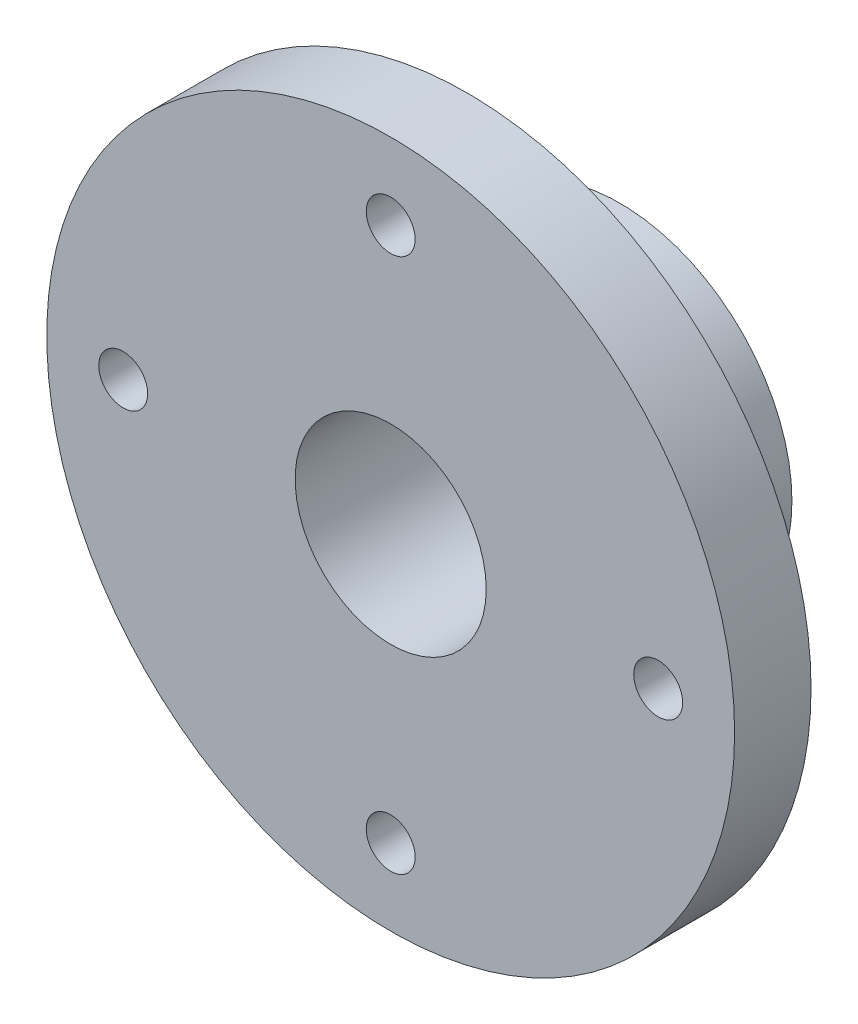
ISO-10303-21;
HEADER;
FILE_DESCRIPTION(('STEP AP214'),'2;1');
FILE_NAME('part.step','',(''),(''),'','','');
FILE_SCHEMA(('AUTOMOTIVE_DESIGN { 1 0 10303 214 1 1 1 1 }'));
ENDSEC;
DATA;
#1=APPLICATION_CONTEXT('core data for automotive mechanical design processes');
#2=APPLICATION_PROTOCOL_DEFINITION('international standard','automotive_design',2000,#1);
#3=PRODUCT_CONTEXT('',#1,'mechanical');
#4=PRODUCT('Part','Part','',(#3));
#5=PRODUCT_RELATED_PRODUCT_CATEGORY('part','',(#4));
#6=PRODUCT_DEFINITION_FORMATION('','',#4);
#7=PRODUCT_DEFINITION_CONTEXT('part definition',#1,'design');
#8=PRODUCT_DEFINITION('design','',#6,#7);
#9=PRODUCT_DEFINITION_SHAPE('','',#8);
#10=(LENGTH_UNIT() NAMED_UNIT(*) SI_UNIT(.MILLI.,.METRE.));
#11=(NAMED_UNIT(*) PLANE_ANGLE_UNIT() SI_UNIT($,.RADIAN.));
#12=(NAMED_UNIT(*) SI_UNIT($,.STERADIAN.) SOLID_ANGLE_UNIT());
#13=UNCERTAINTY_MEASURE_WITH_UNIT(LENGTH_MEASURE(1.E-05),#10,'distance_accuracy_value','');
#14=(GEOMETRIC_REPRESENTATION_CONTEXT(3) GLOBAL_UNCERTAINTY_ASSIGNED_CONTEXT((#13)) GLOBAL_UNIT_ASSIGNED_CONTEXT((#10,
#11,#12)) REPRESENTATION_CONTEXT('',''));
#15=CARTESIAN_POINT('',(0.,0.,0.));
#16=DIRECTION('',(0.,0.,1.));
#17=DIRECTION('',(1.,0.,0.));
#18=AXIS2_PLACEMENT_3D('',#15,#16,#17);
#19=CARTESIAN_POINT('',(0.,0.,-20.));
#20=DIRECTION('',(0.,0.,1.));
#21=DIRECTION('',(1.,0.,0.));
#22=AXIS2_PLACEMENT_3D('',#19,#20,#21);
#23=CYLINDRICAL_SURFACE('',#22,22.5);
#24=CARTESIAN_POINT('',(0.,0.,-20.));
#25=DIRECTION('',(0.,0.,1.));
#26=DIRECTION('',(1.,0.,0.));
#27=AXIS2_PLACEMENT_3D('',#24,#25,#26);
#28=CIRCLE('',#27,22.5);
#29=CARTESIAN_POINT('',(22.5,0.,-20.));
#30=VERTEX_POINT('',#29);
#31=EDGE_CURVE('E11',#30,#30,#28,.T.);
#32=ORIENTED_EDGE('',*,*,#31,.T.);
#33=EDGE_LOOP('',(#32));
#34=FACE_BOUND('',#33,.T.);
#35=CARTESIAN_POINT('',(0.,0.,0.));
#36=DIRECTION('',(0.,0.,1.));
#37=DIRECTION('',(1.,0.,0.));
#38=AXIS2_PLACEMENT_3D('',#35,#36,#37);
#39=CIRCLE('',#38,22.5);
#40=CARTESIAN_POINT('',(22.5,0.,0.));
#41=VERTEX_POINT('',#40);
#42=EDGE_CURVE('E54',#41,#41,#39,.T.);
#43=ORIENTED_EDGE('',*,*,#42,.F.);
#44=EDGE_LOOP('',(#43));
#45=FACE_BOUND('',#44,.T.);
#46=ADVANCED_FACE('F43',(#34,#45),#23,.T.);
#47=CARTESIAN_POINT('',(0.,0.,-20.));
#48=DIRECTION('',(0.,0.,1.));
#49=DIRECTION('',(1.,0.,0.));
#50=AXIS2_PLACEMENT_3D('',#47,#48,#49);
#51=PLANE('',#50);
#52=CARTESIAN_POINT('',(0.,4.,-20.));
#53=DIRECTION('',(0.,0.,1.));
#54=DIRECTION('',(1.,0.,0.));
#55=AXIS2_PLACEMENT_3D('',#52,#53,#54);
#56=CIRCLE('',#55,12.5);
#57=CARTESIAN_POINT('',(4.,15.842719282327,-20.));
#58=VERTEX_POINT('',#57);
#59=CARTESIAN_POINT('',(-4.,15.842719282327,-20.));
#60=VERTEX_POINT('',#59);
#61=EDGE_CURVE('E156',#58,#60,#56,.T.);
#62=ORIENTED_EDGE('',*,*,#61,.T.);
#63=DIRECTION('',(0.,1.,0.));
#64=VECTOR('',#63,1.);
#65=CARTESIAN_POINT('',(-4.,11.842719282327,-20.));
#66=LINE('',#65,#64);
#67=CARTESIAN_POINT('',(-4.,11.842719282327,-20.));
#68=VERTEX_POINT('',#67);
#69=EDGE_CURVE('E98',#68,#60,#66,.T.);
#70=ORIENTED_EDGE('',*,*,#69,.F.);
#71=CARTESIAN_POINT('',(0.,0.,-20.));
#72=DIRECTION('',(0.,0.,1.));
#73=DIRECTION('',(1.,0.,0.));
#74=AXIS2_PLACEMENT_3D('',#71,#72,#73);
#75=CIRCLE('',#74,12.5);
#76=CARTESIAN_POINT('',(4.,11.842719282327,-20.));
#77=VERTEX_POINT('',#76);
#78=EDGE_CURVE('E163',#68,#77,#75,.T.);
#79=ORIENTED_EDGE('',*,*,#78,.T.);
#80=DIRECTION('',(0.,1.,0.));
#81=VECTOR('',#80,1.);
#82=CARTESIAN_POINT('',(4.,11.842719282327,-20.));
#83=LINE('',#82,#81);
#84=EDGE_CURVE('E245',#77,#58,#83,.T.);
#85=ORIENTED_EDGE('',*,*,#84,.T.);
#86=EDGE_LOOP('',(#62,#70,#79,#85));
#87=FACE_BOUND('',#86,.T.);
#88=ORIENTED_EDGE('',*,*,#31,.F.);
#89=EDGE_LOOP('',(#88));
#90=FACE_BOUND('',#89,.T.);
#91=ADVANCED_FACE('F146',(#87,#90),#51,.F.);
#92=CARTESIAN_POINT('',(0.,0.,-20.));
#93=DIRECTION('',(0.,0.,1.));
#94=DIRECTION('',(1.,0.,0.));
#95=AXIS2_PLACEMENT_3D('',#92,#93,#94);
#96=CYLINDRICAL_SURFACE('',#95,12.5);
#97=ORIENTED_EDGE('',*,*,#78,.F.);
#98=DIRECTION('',(0.,0.,1.));
#99=VECTOR('',#98,1.);
#100=CARTESIAN_POINT('',(-4.,11.842719282327,-20.0000000000002));
#101=LINE('',#100,#99);
#102=CARTESIAN_POINT('',(-4.00000000000027,11.8427192823269,-6.99999757515348));
#103=VERTEX_POINT('',#102);
#104=EDGE_CURVE('E71',#68,#103,#101,.T.);
#105=ORIENTED_EDGE('',*,*,#104,.T.);
#106=CARTESIAN_POINT('',(3.99999999999963,11.8427192823271,-7.));
#107=CARTESIAN_POINT('',(4.0000006452399,11.8427190643906,-5.93561889273927));
#108=CARTESIAN_POINT('',(3.56110042047093,12.0055791359126,-4.90438372573486));
#109=CARTESIAN_POINT('',(2.09629423138882,12.3458866465225,-3.43929762907547));
#110=CARTESIAN_POINT('',(1.05534794626299,12.4996524911277,-3.00108354089639));
#111=CARTESIAN_POINT('',(-1.04709973807696,12.5003461482135,-2.99891586146916));
#112=CARTESIAN_POINT('',(-2.09036358080204,12.3471978912915,-3.43390957821057));
#113=CARTESIAN_POINT('',(-3.5649460991903,12.0047521830534,-4.90768717472265));
#114=CARTESIAN_POINT('',(-4.00000000000042,11.8427192823269,-5.9355220537099));
#115=CARTESIAN_POINT('',(-4.00000000000037,11.8427192823269,-6.99999757515349));
#116=B_SPLINE_CURVE_WITH_KNOTS('',3,(#106,#107,#108,#109,#110,#111,#112,#113,#114,#115),
.UNSPECIFIED.,.F.,.F.,(4,2,2,2,4),(0.,0.25,0.5,0.75,1.),.UNSPECIFIED.);
#117=CARTESIAN_POINT('',(3.99999999999963,11.8427192823271,-7.));
#118=VERTEX_POINT('',#117);
#119=EDGE_CURVE('E105',#118,#103,#116,.T.);
#120=ORIENTED_EDGE('',*,*,#119,.F.);
#121=DIRECTION('',(0.,0.,1.));
#122=VECTOR('',#121,1.);
#123=CARTESIAN_POINT('',(4.,11.842719282327,-19.9999999999998));
#124=LINE('',#123,#122);
#125=EDGE_CURVE('E175',#77,#118,#124,.T.);
#126=ORIENTED_EDGE('',*,*,#125,.F.);
#127=EDGE_LOOP('',(#97,#105,#120,#126));
#128=FACE_BOUND('',#127,.T.);
#129=CARTESIAN_POINT('',(0.,0.,10.));
#130=DIRECTION('',(0.,0.,1.));
#131=DIRECTION('',(1.,0.,0.));
#132=AXIS2_PLACEMENT_3D('',#129,#130,#131);
#133=CIRCLE('',#132,12.5);
#134=CARTESIAN_POINT('',(12.5,0.,10.));
#135=VERTEX_POINT('',#134);
#136=EDGE_CURVE('E225',#135,#135,#133,.T.);
#137=ORIENTED_EDGE('',*,*,#136,.T.);
#138=EDGE_LOOP('',(#137));
#139=FACE_BOUND('',#138,.T.);
#140=ADVANCED_FACE('F137',(#128,#139),#96,.F.);
#141=CARTESIAN_POINT('',(0.,0.,10.));
#142=DIRECTION('',(0.,0.,1.));
#143=DIRECTION('',(1.,0.,0.));
#144=AXIS2_PLACEMENT_3D('',#141,#142,#143);
#145=PLANE('',#144);
#146=CARTESIAN_POINT('',(0.,35.,10.));
#147=DIRECTION('',(0.,0.,-1.));
#148=DIRECTION('',(-1.,0.,0.));
#149=AXIS2_PLACEMENT_3D('',#146,#147,#148);
#150=CIRCLE('',#149,3.2);
#151=CARTESIAN_POINT('',(-3.2,35.,10.));
#152=VERTEX_POINT('',#151);
#153=EDGE_CURVE('E314',#152,#152,#150,.T.);
#154=ORIENTED_EDGE('',*,*,#153,.T.);
#155=EDGE_LOOP('',(#154));
#156=FACE_BOUND('',#155,.T.);
#157=CARTESIAN_POINT('',(-35.000000000001,9.88330434368617E-13,10.));
#158=DIRECTION('',(0.,0.,-1.));
#159=DIRECTION('',(-1.,0.,0.));
#160=AXIS2_PLACEMENT_3D('',#157,#158,#159);
#161=CIRCLE('',#160,3.2);
#162=CARTESIAN_POINT('',(-38.200000000001,9.88330434368617E-13,10.));
#163=VERTEX_POINT('',#162);
#164=EDGE_CURVE('E294',#163,#163,#161,.T.);
#165=ORIENTED_EDGE('',*,*,#164,.T.);
#166=EDGE_LOOP('',(#165));
#167=FACE_BOUND('',#166,.T.);
#168=CARTESIAN_POINT('',(-1.97666086873723E-12,-35.,10.));
#169=DIRECTION('',(0.,0.,-1.));
#170=DIRECTION('',(-1.,0.,0.));
#171=AXIS2_PLACEMENT_3D('',#168,#169,#170);
#172=CIRCLE('',#171,3.2);
#173=CARTESIAN_POINT('',(-3.20000000000198,-35.,10.));
#174=VERTEX_POINT('',#173);
#175=EDGE_CURVE('E274',#174,#174,#172,.T.);
#176=ORIENTED_EDGE('',*,*,#175,.T.);
#177=EDGE_LOOP('',(#176));
#178=FACE_BOUND('',#177,.T.);
#179=CARTESIAN_POINT('',(34.999999999999,-9.84044170571601E-13,10.));
#180=DIRECTION('',(0.,0.,-1.));
#181=DIRECTION('',(-1.,0.,0.));
#182=AXIS2_PLACEMENT_3D('',#179,#180,#181);
#183=CIRCLE('',#182,3.2);
#184=CARTESIAN_POINT('',(31.799999999999,-9.84044170571601E-13,10.));
#185=VERTEX_POINT('',#184);
#186=EDGE_CURVE('E212',#185,#185,#183,.T.);
#187=ORIENTED_EDGE('',*,*,#186,.T.);
#188=EDGE_LOOP('',(#187));
#189=FACE_BOUND('',#188,.T.);
#190=CARTESIAN_POINT('',(0.,0.,10.));
#191=DIRECTION('',(0.,0.,1.));
#192=DIRECTION('',(1.,0.,0.));
#193=AXIS2_PLACEMENT_3D('',#190,#191,#192);
#194=CIRCLE('',#193,45.);
#195=CARTESIAN_POINT('',(45.,0.,10.));
#196=VERTEX_POINT('',#195);
#197=EDGE_CURVE('E167',#196,#196,#194,.T.);
#198=ORIENTED_EDGE('',*,*,#197,.T.);
#199=EDGE_LOOP('',(#198));
#200=FACE_BOUND('',#199,.T.);
#201=ORIENTED_EDGE('',*,*,#136,.F.);
#202=EDGE_LOOP('',(#201));
#203=FACE_BOUND('',#202,.T.);
#204=ADVANCED_FACE('F133',(#156,#167,#178,#189,#200,#203),#145,.T.);
#205=CARTESIAN_POINT('',(0.,0.,0.));
#206=DIRECTION('',(0.,0.,1.));
#207=DIRECTION('',(1.,0.,0.));
#208=AXIS2_PLACEMENT_3D('',#205,#206,#207);
#209=PLANE('',#208);
#210=CARTESIAN_POINT('',(0.,35.,0.));
#211=DIRECTION('',(0.,0.,-1.));
#212=DIRECTION('',(-1.,0.,0.));
#213=AXIS2_PLACEMENT_3D('',#210,#211,#212);
#214=CIRCLE('',#213,7.3);
#215=CARTESIAN_POINT('',(-7.3,35.,0.));
#216=VERTEX_POINT('',#215);
#217=EDGE_CURVE('E330',#216,#216,#214,.T.);
#218=ORIENTED_EDGE('',*,*,#217,.F.);
#219=EDGE_LOOP('',(#218));
#220=FACE_BOUND('',#219,.T.);
#221=CARTESIAN_POINT('',(-35.000000000001,9.88330434368617E-13,0.));
#222=DIRECTION('',(0.,0.,-1.));
#223=DIRECTION('',(-1.,0.,0.));
#224=AXIS2_PLACEMENT_3D('',#221,#222,#223);
#225=CIRCLE('',#224,7.3);
#226=CARTESIAN_POINT('',(-42.300000000001,9.88330434368617E-13,0.));
#227=VERTEX_POINT('',#226);
#228=EDGE_CURVE('E310',#227,#227,#225,.T.);
#229=ORIENTED_EDGE('',*,*,#228,.F.);
#230=EDGE_LOOP('',(#229));
#231=FACE_BOUND('',#230,.T.);
#232=CARTESIAN_POINT('',(-1.97666086873723E-12,-35.,0.));
#233=DIRECTION('',(0.,0.,-1.));
#234=DIRECTION('',(-1.,0.,0.));
#235=AXIS2_PLACEMENT_3D('',#232,#233,#234);
#236=CIRCLE('',#235,7.3);
#237=CARTESIAN_POINT('',(-7.30000000000198,-35.,0.));
#238=VERTEX_POINT('',#237);
#239=EDGE_CURVE('E290',#238,#238,#236,.T.);
#240=ORIENTED_EDGE('',*,*,#239,.F.);
#241=EDGE_LOOP('',(#240));
#242=FACE_BOUND('',#241,.T.);
#243=CARTESIAN_POINT('',(34.999999999999,-9.84044170571601E-13,0.));
#244=DIRECTION('',(0.,0.,-1.));
#245=DIRECTION('',(-1.,0.,0.));
#246=AXIS2_PLACEMENT_3D('',#243,#244,#245);
#247=CIRCLE('',#246,7.3);
#248=CARTESIAN_POINT('',(27.699999999999,-9.84044170571601E-13,0.));
#249=VERTEX_POINT('',#248);
#250=EDGE_CURVE('E270',#249,#249,#247,.T.);
#251=ORIENTED_EDGE('',*,*,#250,.F.);
#252=EDGE_LOOP('',(#251));
#253=FACE_BOUND('',#252,.T.);
#254=ORIENTED_EDGE('',*,*,#42,.T.);
#255=EDGE_LOOP('',(#254));
#256=FACE_BOUND('',#255,.T.);
#257=CARTESIAN_POINT('',(0.,0.,0.));
#258=DIRECTION('',(0.,0.,1.));
#259=DIRECTION('',(1.,0.,0.));
#260=AXIS2_PLACEMENT_3D('',#257,#258,#259);
#261=CIRCLE('',#260,45.);
#262=CARTESIAN_POINT('',(45.,0.,0.));
#263=VERTEX_POINT('',#262);
#264=EDGE_CURVE('E228',#263,#263,#261,.T.);
#265=ORIENTED_EDGE('',*,*,#264,.F.);
#266=EDGE_LOOP('',(#265));
#267=FACE_BOUND('',#266,.T.);
#268=ADVANCED_FACE('F136',(#220,#231,#242,#253,#256,#267),#209,.F.);
#269=CARTESIAN_POINT('',(0.,0.,10.));
#270=DIRECTION('',(0.,0.,-1.));
#271=DIRECTION('',(-1.,0.,0.));
#272=AXIS2_PLACEMENT_3D('',#269,#270,#271);
#273=CYLINDRICAL_SURFACE('',#272,45.);
#274=ORIENTED_EDGE('',*,*,#197,.F.);
#275=EDGE_LOOP('',(#274));
#276=FACE_BOUND('',#275,.T.);
#277=ORIENTED_EDGE('',*,*,#264,.T.);
#278=EDGE_LOOP('',(#277));
#279=FACE_BOUND('',#278,.T.);
#280=ADVANCED_FACE('F129',(#276,#279),#273,.T.);
#281=CARTESIAN_POINT('',(0.,4.,-20.));
#282=DIRECTION('',(0.,0.,1.));
#283=DIRECTION('',(1.,0.,0.));
#284=AXIS2_PLACEMENT_3D('',#281,#282,#283);
#285=CYLINDRICAL_SURFACE('',#284,12.5);
#286=ORIENTED_EDGE('',*,*,#61,.F.);
#287=DIRECTION('',(0.,0.,1.));
#288=VECTOR('',#287,1.);
#289=CARTESIAN_POINT('',(4.,15.842719282327,-19.9999999999998));
#290=LINE('',#289,#288);
#291=CARTESIAN_POINT('',(3.99999999999982,15.8427192823271,-7.));
#292=VERTEX_POINT('',#291);
#293=EDGE_CURVE('E86',#58,#292,#290,.T.);
#294=ORIENTED_EDGE('',*,*,#293,.T.);
#295=CARTESIAN_POINT('',(-4.00000000000037,15.8427192823268,-6.99999757515349));
#296=CARTESIAN_POINT('',(-4.00000000000042,15.8427192823268,-5.9355220537099));
#297=CARTESIAN_POINT('',(-3.5649460991903,16.0047521830533,-4.90768717472265));
#298=CARTESIAN_POINT('',(-2.09036358080204,16.3471978912914,-3.43390957821057));
#299=CARTESIAN_POINT('',(-1.04709973807696,16.5003461482134,-2.99891586146916));
#300=CARTESIAN_POINT('',(1.05534794626299,16.4996524911276,-3.00108354089639));
#301=CARTESIAN_POINT('',(2.09629423138882,16.3458866465225,-3.43929762907547));
#302=CARTESIAN_POINT('',(3.56110042047093,16.0055791359125,-4.90438372573486));
#303=CARTESIAN_POINT('',(4.0000006452399,15.8427190643905,-5.93561889273927));
#304=CARTESIAN_POINT('',(3.99999999999963,15.8427192823271,-7.));
#305=B_SPLINE_CURVE_WITH_KNOTS('',3,(#295,#296,#297,#298,#299,#300,#301,#302,#303,#304),
.UNSPECIFIED.,.F.,.F.,(4,2,2,2,4),(0.,0.25,0.5,0.75,1.),.UNSPECIFIED.);
#306=CARTESIAN_POINT('',(-4.00000000000027,15.8427192823269,-6.99999757515348));
#307=VERTEX_POINT('',#306);
#308=EDGE_CURVE('E91',#292,#307,#305,.F.);
#309=ORIENTED_EDGE('',*,*,#308,.T.);
#310=DIRECTION('',(0.,0.,1.));
#311=VECTOR('',#310,1.);
#312=CARTESIAN_POINT('',(-4.,15.842719282327,-20.0000000000002));
#313=LINE('',#312,#311);
#314=EDGE_CURVE('E95',#60,#307,#313,.T.);
#315=ORIENTED_EDGE('',*,*,#314,.F.);
#316=EDGE_LOOP('',(#286,#294,#309,#315));
#317=FACE_BOUND('',#316,.T.);
#318=ADVANCED_FACE('F110',(#317),#285,.F.);
#319=CARTESIAN_POINT('',(-4.,11.842719282327,-20.0000000000002));
#320=DIRECTION('',(-1.,0.,0.));
#321=DIRECTION('',(0.,0.,1.));
#322=AXIS2_PLACEMENT_3D('',#319,#320,#321);
#323=PLANE('',#322);
#324=ORIENTED_EDGE('',*,*,#314,.T.);
#325=DIRECTION('',(0.,1.,0.));
#326=VECTOR('',#325,1.);
#327=CARTESIAN_POINT('',(-4.00000000000037,11.8427192823269,-6.99999757515349));
#328=LINE('',#327,#326);
#329=EDGE_CURVE('E97',#103,#307,#328,.T.);
#330=ORIENTED_EDGE('',*,*,#329,.F.);
#331=ORIENTED_EDGE('',*,*,#104,.F.);
#332=ORIENTED_EDGE('',*,*,#69,.T.);
#333=EDGE_LOOP('',(#324,#330,#331,#332));
#334=FACE_BOUND('',#333,.T.);
#335=ADVANCED_FACE('F96',(#334),#323,.F.);
#336=CARTESIAN_POINT('',(4.,11.842719282327,-19.9999999999998));
#337=DIRECTION('',(-1.,0.,0.));
#338=DIRECTION('',(0.,0.,1.));
#339=AXIS2_PLACEMENT_3D('',#336,#337,#338);
#340=PLANE('',#339);
#341=ORIENTED_EDGE('',*,*,#293,.F.);
#342=ORIENTED_EDGE('',*,*,#84,.F.);
#343=ORIENTED_EDGE('',*,*,#125,.T.);
#344=DIRECTION('',(0.,1.,0.));
#345=VECTOR('',#344,1.);
#346=CARTESIAN_POINT('',(4.,11.842719282327,-7.));
#347=LINE('',#346,#345);
#348=EDGE_CURVE('E62',#118,#292,#347,.T.);
#349=ORIENTED_EDGE('',*,*,#348,.T.);
#350=EDGE_LOOP('',(#341,#342,#343,#349));
#351=FACE_BOUND('',#350,.T.);
#352=ADVANCED_FACE('F131',(#351),#340,.T.);
#353=CARTESIAN_POINT('',(3.99999999999963,11.8427192823271,-7.));
#354=CARTESIAN_POINT('',(4.0000006452399,11.8427190643906,-5.93561889273927));
#355=CARTESIAN_POINT('',(3.56110042047093,12.0055791359126,-4.90438372573486));
#356=CARTESIAN_POINT('',(2.09629423138882,12.3458866465225,-3.43929762907547));
#357=CARTESIAN_POINT('',(1.05534794626299,12.4996524911277,-3.00108354089639));
#358=CARTESIAN_POINT('',(-1.04709973807696,12.5003461482135,-2.99891586146916));
#359=CARTESIAN_POINT('',(-2.09036358080204,12.3471978912915,-3.43390957821057));
#360=CARTESIAN_POINT('',(-3.5649460991903,12.0047521830534,-4.90768717472265));
#361=CARTESIAN_POINT('',(-4.00000000000042,11.8427192823269,-5.9355220537099));
#362=CARTESIAN_POINT('',(-4.00000000000037,11.8427192823269,-6.99999757515349));
#363=B_SPLINE_CURVE_WITH_KNOTS('',3,(#353,#354,#355,#356,#357,#358,#359,#360,#361,#362),
.UNSPECIFIED.,.F.,.F.,(4,2,2,2,4),(0.,0.25,0.5,0.75,1.),.UNSPECIFIED.);
#364=DIRECTION('',(0.,1.,0.));
#365=VECTOR('',#364,1.);
#366=SURFACE_OF_LINEAR_EXTRUSION('',#363,#365);
#367=ORIENTED_EDGE('',*,*,#308,.F.);
#368=ORIENTED_EDGE('',*,*,#348,.F.);
#369=ORIENTED_EDGE('',*,*,#119,.T.);
#370=ORIENTED_EDGE('',*,*,#329,.T.);
#371=EDGE_LOOP('',(#367,#368,#369,#370));
#372=FACE_BOUND('',#371,.T.);
#373=ADVANCED_FACE('F103',(#372),#366,.T.);
#374=CARTESIAN_POINT('',(34.999999999999,-9.84044170571601E-13,0.));
#375=DIRECTION('',(0.,0.,-1.));
#376=DIRECTION('',(-1.,0.,0.));
#377=AXIS2_PLACEMENT_3D('',#374,#375,#376);
#378=CYLINDRICAL_SURFACE('',#377,3.2);
#379=ORIENTED_EDGE('',*,*,#186,.F.);
#380=EDGE_LOOP('',(#379));
#381=FACE_BOUND('',#380,.T.);
#382=CARTESIAN_POINT('',(34.999999999999,-9.84044170571601E-13,4.38));
#383=DIRECTION('',(0.,0.,-1.));
#384=DIRECTION('',(-1.,0.,0.));
#385=AXIS2_PLACEMENT_3D('',#382,#383,#384);
#386=CIRCLE('',#385,3.2);
#387=CARTESIAN_POINT('',(31.799999999999,-9.84044170571601E-13,4.38));
#388=VERTEX_POINT('',#387);
#389=EDGE_CURVE('E254',#388,#388,#386,.T.);
#390=ORIENTED_EDGE('',*,*,#389,.T.);
#391=EDGE_LOOP('',(#390));
#392=FACE_BOUND('',#391,.T.);
#393=ADVANCED_FACE('F130',(#381,#392),#378,.F.);
#394=CARTESIAN_POINT('',(42.274999999999,-9.84044170571601E-13,4.38));
#395=DIRECTION('',(0.,0.,1.));
#396=DIRECTION('',(1.,0.,0.));
#397=AXIS2_PLACEMENT_3D('',#394,#395,#396);
#398=PLANE('',#397);
#399=ORIENTED_EDGE('',*,*,#389,.F.);
#400=EDGE_LOOP('',(#399));
#401=FACE_BOUND('',#400,.T.);
#402=CARTESIAN_POINT('',(34.999999999999,-9.84044170571601E-13,4.38));
#403=DIRECTION('',(0.,0.,-1.));
#404=DIRECTION('',(-1.,0.,0.));
#405=AXIS2_PLACEMENT_3D('',#402,#403,#404);
#406=CIRCLE('',#405,7.275);
#407=CARTESIAN_POINT('',(27.724999999999,-9.84044170571601E-13,4.38));
#408=VERTEX_POINT('',#407);
#409=EDGE_CURVE('E259',#408,#408,#406,.T.);
#410=ORIENTED_EDGE('',*,*,#409,.T.);
#411=EDGE_LOOP('',(#410));
#412=FACE_BOUND('',#411,.T.);
#413=ADVANCED_FACE('F356',(#401,#412),#398,.F.);
#414=CARTESIAN_POINT('',(34.999999999999,-9.84044170571601E-13,0.));
#415=DIRECTION('',(0.,0.,-1.));
#416=DIRECTION('',(-1.,0.,0.));
#417=AXIS2_PLACEMENT_3D('',#414,#415,#416);
#418=CYLINDRICAL_SURFACE('',#417,7.275);
#419=ORIENTED_EDGE('',*,*,#409,.F.);
#420=EDGE_LOOP('',(#419));
#421=FACE_BOUND('',#420,.T.);
#422=CARTESIAN_POINT('',(34.999999999999,-9.84044170571601E-13,0.0250000000000012));
#423=DIRECTION('',(0.,0.,-1.));
#424=DIRECTION('',(-1.,0.,0.));
#425=AXIS2_PLACEMENT_3D('',#422,#423,#424);
#426=CIRCLE('',#425,7.275);
#427=CARTESIAN_POINT('',(27.724999999999,-9.84044170571601E-13,0.0250000000000012));
#428=VERTEX_POINT('',#427);
#429=EDGE_CURVE('E264',#428,#428,#426,.T.);
#430=ORIENTED_EDGE('',*,*,#429,.T.);
#431=EDGE_LOOP('',(#430));
#432=FACE_BOUND('',#431,.T.);
#433=ADVANCED_FACE('F346',(#421,#432),#418,.F.);
#434=CARTESIAN_POINT('',(34.999999999999,-9.84044170571601E-13,0.));
#435=DIRECTION('',(0.,0.,-1.));
#436=DIRECTION('',(-1.,0.,0.));
#437=AXIS2_PLACEMENT_3D('',#434,#435,#436);
#438=CONICAL_SURFACE('',#437,7.3,0.785398163397507);
#439=ORIENTED_EDGE('',*,*,#429,.F.);
#440=EDGE_LOOP('',(#439));
#441=FACE_BOUND('',#440,.T.);
#442=ORIENTED_EDGE('',*,*,#250,.T.);
#443=EDGE_LOOP('',(#442));
#444=FACE_BOUND('',#443,.T.);
#445=ADVANCED_FACE('F343',(#441,#444),#438,.F.);
#446=CARTESIAN_POINT('',(-1.97666086873723E-12,-35.,0.));
#447=DIRECTION('',(0.,0.,-1.));
#448=DIRECTION('',(-1.,0.,0.));
#449=AXIS2_PLACEMENT_3D('',#446,#447,#448);
#450=CYLINDRICAL_SURFACE('',#449,3.2);
#451=ORIENTED_EDGE('',*,*,#175,.F.);
#452=EDGE_LOOP('',(#451));
#453=FACE_BOUND('',#452,.T.);
#454=CARTESIAN_POINT('',(-1.97666086873723E-12,-35.,4.38));
#455=DIRECTION('',(0.,0.,-1.));
#456=DIRECTION('',(-1.,0.,0.));
#457=AXIS2_PLACEMENT_3D('',#454,#455,#456);
#458=CIRCLE('',#457,3.2);
#459=CARTESIAN_POINT('',(-3.20000000000198,-35.,4.38));
#460=VERTEX_POINT('',#459);
#461=EDGE_CURVE('E278',#460,#460,#458,.T.);
#462=ORIENTED_EDGE('',*,*,#461,.T.);
#463=EDGE_LOOP('',(#462));
#464=FACE_BOUND('',#463,.T.);
#465=ADVANCED_FACE('F345',(#453,#464),#450,.F.);
#466=CARTESIAN_POINT('',(7.27499999999802,-35.,4.38));
#467=DIRECTION('',(0.,0.,1.));
#468=DIRECTION('',(1.,0.,0.));
#469=AXIS2_PLACEMENT_3D('',#466,#467,#468);
#470=PLANE('',#469);
#471=ORIENTED_EDGE('',*,*,#461,.F.);
#472=EDGE_LOOP('',(#471));
#473=FACE_BOUND('',#472,.T.);
#474=CARTESIAN_POINT('',(-1.97666086873723E-12,-35.,4.38));
#475=DIRECTION('',(0.,0.,-1.));
#476=DIRECTION('',(-1.,0.,0.));
#477=AXIS2_PLACEMENT_3D('',#474,#475,#476);
#478=CIRCLE('',#477,7.275);
#479=CARTESIAN_POINT('',(-7.27500000000198,-35.,4.38));
#480=VERTEX_POINT('',#479);
#481=EDGE_CURVE('E282',#480,#480,#478,.T.);
#482=ORIENTED_EDGE('',*,*,#481,.T.);
#483=EDGE_LOOP('',(#482));
#484=FACE_BOUND('',#483,.T.);
#485=ADVANCED_FACE('F353',(#473,#484),#470,.F.);
#486=CARTESIAN_POINT('',(-1.97666086873723E-12,-35.,0.));
#487=DIRECTION('',(0.,0.,-1.));
#488=DIRECTION('',(-1.,0.,0.));
#489=AXIS2_PLACEMENT_3D('',#486,#487,#488);
#490=CYLINDRICAL_SURFACE('',#489,7.275);
#491=ORIENTED_EDGE('',*,*,#481,.F.);
#492=EDGE_LOOP('',(#491));
#493=FACE_BOUND('',#492,.T.);
#494=CARTESIAN_POINT('',(-1.97666086873723E-12,-35.,0.0250000000000012));
#495=DIRECTION('',(0.,0.,-1.));
#496=DIRECTION('',(-1.,0.,0.));
#497=AXIS2_PLACEMENT_3D('',#494,#495,#496);
#498=CIRCLE('',#497,7.275);
#499=CARTESIAN_POINT('',(-7.27500000000197,-35.,0.0250000000000012));
#500=VERTEX_POINT('',#499);
#501=EDGE_CURVE('E286',#500,#500,#498,.T.);
#502=ORIENTED_EDGE('',*,*,#501,.T.);
#503=EDGE_LOOP('',(#502));
#504=FACE_BOUND('',#503,.T.);
#505=ADVANCED_FACE('F402',(#493,#504),#490,.F.);
#506=CARTESIAN_POINT('',(-1.97666086873723E-12,-35.,0.));
#507=DIRECTION('',(0.,0.,-1.));
#508=DIRECTION('',(-1.,0.,0.));
#509=AXIS2_PLACEMENT_3D('',#506,#507,#508);
#510=CONICAL_SURFACE('',#509,7.3,0.785398163397455);
#511=ORIENTED_EDGE('',*,*,#501,.F.);
#512=EDGE_LOOP('',(#511));
#513=FACE_BOUND('',#512,.T.);
#514=ORIENTED_EDGE('',*,*,#239,.T.);
#515=EDGE_LOOP('',(#514));
#516=FACE_BOUND('',#515,.T.);
#517=ADVANCED_FACE('F412',(#513,#516),#510,.F.);
#518=CARTESIAN_POINT('',(-35.000000000001,9.88330434368617E-13,0.));
#519=DIRECTION('',(0.,0.,-1.));
#520=DIRECTION('',(-1.,0.,0.));
#521=AXIS2_PLACEMENT_3D('',#518,#519,#520);
#522=CYLINDRICAL_SURFACE('',#521,3.2);
#523=ORIENTED_EDGE('',*,*,#164,.F.);
#524=EDGE_LOOP('',(#523));
#525=FACE_BOUND('',#524,.T.);
#526=CARTESIAN_POINT('',(-35.000000000001,9.88330434368617E-13,4.38));
#527=DIRECTION('',(0.,0.,-1.));
#528=DIRECTION('',(-1.,0.,0.));
#529=AXIS2_PLACEMENT_3D('',#526,#527,#528);
#530=CIRCLE('',#529,3.2);
#531=CARTESIAN_POINT('',(-38.200000000001,9.88330434368617E-13,4.38));
#532=VERTEX_POINT('',#531);
#533=EDGE_CURVE('E298',#532,#532,#530,.T.);
#534=ORIENTED_EDGE('',*,*,#533,.T.);
#535=EDGE_LOOP('',(#534));
#536=FACE_BOUND('',#535,.T.);
#537=ADVANCED_FACE('F423',(#525,#536),#522,.F.);
#538=CARTESIAN_POINT('',(-27.725000000001,9.88330434368617E-13,4.38));
#539=DIRECTION('',(0.,0.,1.));
#540=DIRECTION('',(1.,0.,0.));
#541=AXIS2_PLACEMENT_3D('',#538,#539,#540);
#542=PLANE('',#541);
#543=ORIENTED_EDGE('',*,*,#533,.F.);
#544=EDGE_LOOP('',(#543));
#545=FACE_BOUND('',#544,.T.);
#546=CARTESIAN_POINT('',(-35.000000000001,9.88330434368617E-13,4.38));
#547=DIRECTION('',(0.,0.,-1.));
#548=DIRECTION('',(-1.,0.,0.));
#549=AXIS2_PLACEMENT_3D('',#546,#547,#548);
#550=CIRCLE('',#549,7.275);
#551=CARTESIAN_POINT('',(-42.275000000001,9.88330434368617E-13,4.38));
#552=VERTEX_POINT('',#551);
#553=EDGE_CURVE('E302',#552,#552,#550,.T.);
#554=ORIENTED_EDGE('',*,*,#553,.T.);
#555=EDGE_LOOP('',(#554));
#556=FACE_BOUND('',#555,.T.);
#557=ADVANCED_FACE('F434',(#545,#556),#542,.F.);
#558=CARTESIAN_POINT('',(-35.000000000001,9.88330434368617E-13,0.));
#559=DIRECTION('',(0.,0.,-1.));
#560=DIRECTION('',(-1.,0.,0.));
#561=AXIS2_PLACEMENT_3D('',#558,#559,#560);
#562=CYLINDRICAL_SURFACE('',#561,7.275);
#563=ORIENTED_EDGE('',*,*,#553,.F.);
#564=EDGE_LOOP('',(#563));
#565=FACE_BOUND('',#564,.T.);
#566=CARTESIAN_POINT('',(-35.000000000001,9.88330434368617E-13,0.0250000000000012));
#567=DIRECTION('',(0.,0.,-1.));
#568=DIRECTION('',(-1.,0.,0.));
#569=AXIS2_PLACEMENT_3D('',#566,#567,#568);
#570=CIRCLE('',#569,7.275);
#571=CARTESIAN_POINT('',(-42.275000000001,9.88330434368617E-13,0.0250000000000012));
#572=VERTEX_POINT('',#571);
#573=EDGE_CURVE('E306',#572,#572,#570,.T.);
#574=ORIENTED_EDGE('',*,*,#573,.T.);
#575=EDGE_LOOP('',(#574));
#576=FACE_BOUND('',#575,.T.);
#577=ADVANCED_FACE('F445',(#565,#576),#562,.F.);
#578=CARTESIAN_POINT('',(-35.000000000001,9.88330434368617E-13,0.));
#579=DIRECTION('',(0.,0.,-1.));
#580=DIRECTION('',(-1.,0.,0.));
#581=AXIS2_PLACEMENT_3D('',#578,#579,#580);
#582=CONICAL_SURFACE('',#581,7.3,0.785398163397507);
#583=ORIENTED_EDGE('',*,*,#573,.F.);
#584=EDGE_LOOP('',(#583));
#585=FACE_BOUND('',#584,.T.);
#586=ORIENTED_EDGE('',*,*,#228,.T.);
#587=EDGE_LOOP('',(#586));
#588=FACE_BOUND('',#587,.T.);
#589=ADVANCED_FACE('F456',(#585,#588),#582,.F.);
#590=CARTESIAN_POINT('',(0.,35.,0.));
#591=DIRECTION('',(0.,0.,-1.));
#592=DIRECTION('',(-1.,0.,0.));
#593=AXIS2_PLACEMENT_3D('',#590,#591,#592);
#594=CYLINDRICAL_SURFACE('',#593,3.2);
#595=ORIENTED_EDGE('',*,*,#153,.F.);
#596=EDGE_LOOP('',(#595));
#597=FACE_BOUND('',#596,.T.);
#598=CARTESIAN_POINT('',(0.,35.,4.38));
#599=DIRECTION('',(0.,0.,-1.));
#600=DIRECTION('',(-1.,0.,0.));
#601=AXIS2_PLACEMENT_3D('',#598,#599,#600);
#602=CIRCLE('',#601,3.2);
#603=CARTESIAN_POINT('',(-3.2,35.,4.38));
#604=VERTEX_POINT('',#603);
#605=EDGE_CURVE('E318',#604,#604,#602,.T.);
#606=ORIENTED_EDGE('',*,*,#605,.T.);
#607=EDGE_LOOP('',(#606));
#608=FACE_BOUND('',#607,.T.);
#609=ADVANCED_FACE('F467',(#597,#608),#594,.F.);
#610=CARTESIAN_POINT('',(7.275,35.,4.38));
#611=DIRECTION('',(0.,0.,1.));
#612=DIRECTION('',(1.,0.,0.));
#613=AXIS2_PLACEMENT_3D('',#610,#611,#612);
#614=PLANE('',#613);
#615=ORIENTED_EDGE('',*,*,#605,.F.);
#616=EDGE_LOOP('',(#615));
#617=FACE_BOUND('',#616,.T.);
#618=CARTESIAN_POINT('',(0.,35.,4.38));
#619=DIRECTION('',(0.,0.,-1.));
#620=DIRECTION('',(-1.,0.,0.));
#621=AXIS2_PLACEMENT_3D('',#618,#619,#620);
#622=CIRCLE('',#621,7.275);
#623=CARTESIAN_POINT('',(-7.275,35.,4.38));
#624=VERTEX_POINT('',#623);
#625=EDGE_CURVE('E322',#624,#624,#622,.T.);
#626=ORIENTED_EDGE('',*,*,#625,.T.);
#627=EDGE_LOOP('',(#626));
#628=FACE_BOUND('',#627,.T.);
#629=ADVANCED_FACE('F478',(#617,#628),#614,.F.);
#630=CARTESIAN_POINT('',(0.,35.,0.));
#631=DIRECTION('',(0.,0.,-1.));
#632=DIRECTION('',(-1.,0.,0.));
#633=AXIS2_PLACEMENT_3D('',#630,#631,#632);
#634=CYLINDRICAL_SURFACE('',#633,7.275);
#635=ORIENTED_EDGE('',*,*,#625,.F.);
#636=EDGE_LOOP('',(#635));
#637=FACE_BOUND('',#636,.T.);
#638=CARTESIAN_POINT('',(0.,35.,0.0250000000000012));
#639=DIRECTION('',(0.,0.,-1.));
#640=DIRECTION('',(-1.,0.,0.));
#641=AXIS2_PLACEMENT_3D('',#638,#639,#640);
#642=CIRCLE('',#641,7.275);
#643=CARTESIAN_POINT('',(-7.275,35.,0.0250000000000012));
#644=VERTEX_POINT('',#643);
#645=EDGE_CURVE('E326',#644,#644,#642,.T.);
#646=ORIENTED_EDGE('',*,*,#645,.T.);
#647=EDGE_LOOP('',(#646));
#648=FACE_BOUND('',#647,.T.);
#649=ADVANCED_FACE('F489',(#637,#648),#634,.F.);
#650=CARTESIAN_POINT('',(0.,35.,0.));
#651=DIRECTION('',(0.,0.,-1.));
#652=DIRECTION('',(-1.,0.,0.));
#653=AXIS2_PLACEMENT_3D('',#650,#651,#652);
#654=CONICAL_SURFACE('',#653,7.3,0.785398163397455);
#655=ORIENTED_EDGE('',*,*,#645,.F.);
#656=EDGE_LOOP('',(#655));
#657=FACE_BOUND('',#656,.T.);
#658=ORIENTED_EDGE('',*,*,#217,.T.);
#659=EDGE_LOOP('',(#658));
#660=FACE_BOUND('',#659,.T.);
#661=ADVANCED_FACE('F335',(#657,#660),#654,.F.);
#662=CLOSED_SHELL('',(#46,#91,#140,#204,#268,#280,#318,#335,#352,#373,#393,#413,#433,#445,#465,
#485,#505,#517,#537,#557,#577,#589,#609,#629,#649,#661));
#663=MANIFOLD_SOLID_BREP('B2',#662);
#664=ADVANCED_BREP_SHAPE_REPRESENTATION('',(#18,#663),#14);
#665=SHAPE_DEFINITION_REPRESENTATION(#9,#664);
ENDSEC;
END-ISO-10303-21;
